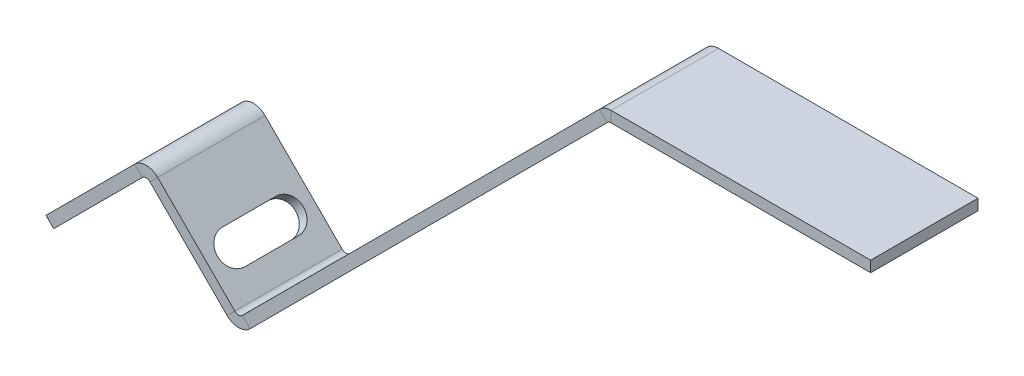
ISO-10303-21;
HEADER;
FILE_DESCRIPTION(('STEP AP214'),'2;1');
FILE_NAME('part.step','',(''),(''),'','','');
FILE_SCHEMA(('AUTOMOTIVE_DESIGN { 1 0 10303 214 1 1 1 1 }'));
ENDSEC;
DATA;
#1=APPLICATION_CONTEXT('core data for automotive mechanical design processes');
#2=APPLICATION_PROTOCOL_DEFINITION('international standard','automotive_design',2000,#1);
#3=PRODUCT_CONTEXT('',#1,'mechanical');
#4=PRODUCT('Part','Part','',(#3));
#5=PRODUCT_RELATED_PRODUCT_CATEGORY('part','',(#4));
#6=PRODUCT_DEFINITION_FORMATION('','',#4);
#7=PRODUCT_DEFINITION_CONTEXT('part definition',#1,'design');
#8=PRODUCT_DEFINITION('design','',#6,#7);
#9=PRODUCT_DEFINITION_SHAPE('','',#8);
#10=(LENGTH_UNIT() NAMED_UNIT(*) SI_UNIT(.MILLI.,.METRE.));
#11=(NAMED_UNIT(*) PLANE_ANGLE_UNIT() SI_UNIT($,.RADIAN.));
#12=(NAMED_UNIT(*) SI_UNIT($,.STERADIAN.) SOLID_ANGLE_UNIT());
#13=UNCERTAINTY_MEASURE_WITH_UNIT(LENGTH_MEASURE(1.E-05),#10,'distance_accuracy_value','');
#14=(GEOMETRIC_REPRESENTATION_CONTEXT(3) GLOBAL_UNCERTAINTY_ASSIGNED_CONTEXT((#13)) GLOBAL_UNIT_ASSIGNED_CONTEXT((#10,
#11,#12)) REPRESENTATION_CONTEXT('',''));
#15=CARTESIAN_POINT('',(0.,0.,0.));
#16=DIRECTION('',(0.,0.,1.));
#17=DIRECTION('',(1.,0.,0.));
#18=AXIS2_PLACEMENT_3D('',#15,#16,#17);
#19=CARTESIAN_POINT('',(-0.707106781186552,10.5182133701499,10.));
#20=DIRECTION('',(0.,0.,1.));
#21=DIRECTION('',(1.,0.,0.));
#22=AXIS2_PLACEMENT_3D('',#19,#20,#21);
#23=PLANE('',#22);
#24=DIRECTION('',(-0.70710678118655,0.707106781186545,0.));
#25=VECTOR('',#24,1.);
#26=CARTESIAN_POINT('',(-0.707106781186552,10.5182133701499,10.));
#27=LINE('',#26,#25);
#28=CARTESIAN_POINT('',(-0.707106781186552,10.5182133701499,10.));
#29=VERTEX_POINT('',#28);
#30=CARTESIAN_POINT('',(-2.14394776055762,11.955054349521,10.));
#31=VERTEX_POINT('',#30);
#32=EDGE_CURVE('E11',#29,#31,#27,.T.);
#33=ORIENTED_EDGE('',*,*,#32,.F.);
#34=CARTESIAN_POINT('',(0.,9.81110658896337,10.));
#35=DIRECTION('',(0.,0.,1.));
#36=DIRECTION('',(1.,0.,0.));
#37=AXIS2_PLACEMENT_3D('',#34,#35,#36);
#38=CIRCLE('',#37,1.);
#39=CARTESIAN_POINT('',(0.707106781186548,10.5182133701499,10.));
#40=VERTEX_POINT('',#39);
#41=EDGE_CURVE('E296',#29,#40,#38,.F.);
#42=ORIENTED_EDGE('',*,*,#41,.T.);
#43=DIRECTION('',(-0.707106781186549,-0.707106781186546,0.));
#44=VECTOR('',#43,1.);
#45=CARTESIAN_POINT('',(2.14394776055761,11.955054349521,10.));
#46=LINE('',#45,#44);
#47=CARTESIAN_POINT('',(2.14394776055761,11.955054349521,10.));
#48=VERTEX_POINT('',#47);
#49=EDGE_CURVE('E42',#48,#40,#46,.T.);
#50=ORIENTED_EDGE('',*,*,#49,.F.);
#51=CARTESIAN_POINT('',(0.,9.81110658896337,10.));
#52=DIRECTION('',(0.,0.,1.));
#53=DIRECTION('',(1.,0.,0.));
#54=AXIS2_PLACEMENT_3D('',#51,#52,#53);
#55=CIRCLE('',#54,3.032);
#56=EDGE_CURVE('E284',#31,#48,#55,.F.);
#57=ORIENTED_EDGE('',*,*,#56,.F.);
#58=EDGE_LOOP('',(#33,#42,#50,#57));
#59=FACE_BOUND('',#58,.T.);
#60=ADVANCED_FACE('F35',(#59),#23,.T.);
#61=CARTESIAN_POINT('',(2.14394776055761,11.955054349521,10.));
#62=DIRECTION('',(0.,0.,1.));
#63=DIRECTION('',(1.,0.,0.));
#64=AXIS2_PLACEMENT_3D('',#61,#62,#63);
#65=PLANE('',#64);
#66=DIRECTION('',(0.707106781186546,0.707106781186549,0.));
#67=VECTOR('',#66,1.);
#68=CARTESIAN_POINT('',(-17.2253201513364,-6.,10.));
#69=LINE('',#68,#67);
#70=CARTESIAN_POINT('',(-17.2253201513364,-6.,10.));
#71=VERTEX_POINT('',#70);
#72=EDGE_CURVE('E293',#71,#29,#69,.T.);
#73=ORIENTED_EDGE('',*,*,#72,.T.);
#74=ORIENTED_EDGE('',*,*,#32,.T.);
#75=DIRECTION('',(0.707106781186546,0.707106781186549,0.));
#76=VECTOR('',#75,1.);
#77=CARTESIAN_POINT('',(-18.6621611307075,-4.56315902062894,10.));
#78=LINE('',#77,#76);
#79=CARTESIAN_POINT('',(-18.6621611307075,-4.56315902062894,10.));
#80=VERTEX_POINT('',#79);
#81=EDGE_CURVE('E287',#80,#31,#78,.T.);
#82=ORIENTED_EDGE('',*,*,#81,.F.);
#83=DIRECTION('',(-0.707106781186549,0.707106781186546,0.));
#84=VECTOR('',#83,1.);
#85=CARTESIAN_POINT('',(-17.2253201513364,-6.,10.));
#86=LINE('',#85,#84);
#87=EDGE_CURVE('E290',#71,#80,#86,.T.);
#88=ORIENTED_EDGE('',*,*,#87,.F.);
#89=EDGE_LOOP('',(#73,#74,#82,#88));
#90=FACE_BOUND('',#89,.T.);
#91=ADVANCED_FACE('F461',(#90),#65,.T.);
#92=CARTESIAN_POINT('',(0.707106781186548,10.5182133701499,-10.));
#93=DIRECTION('',(0.,0.,-1.));
#94=DIRECTION('',(-1.,0.,0.));
#95=AXIS2_PLACEMENT_3D('',#92,#93,#94);
#96=PLANE('',#95);
#97=DIRECTION('',(0.707106781186549,0.707106781186546,0.));
#98=VECTOR('',#97,1.);
#99=CARTESIAN_POINT('',(0.707106781186548,10.5182133701499,-10.));
#100=LINE('',#99,#98);
#101=CARTESIAN_POINT('',(0.707106781186548,10.5182133701499,-10.));
#102=VERTEX_POINT('',#101);
#103=CARTESIAN_POINT('',(2.14394776055761,11.955054349521,-10.));
#104=VERTEX_POINT('',#103);
#105=EDGE_CURVE('E419',#102,#104,#100,.T.);
#106=ORIENTED_EDGE('',*,*,#105,.F.);
#107=CARTESIAN_POINT('',(0.,9.81110658896337,-10.));
#108=DIRECTION('',(0.,0.,1.));
#109=DIRECTION('',(1.,0.,0.));
#110=AXIS2_PLACEMENT_3D('',#107,#108,#109);
#111=CIRCLE('',#110,1.);
#112=CARTESIAN_POINT('',(-0.707106781186552,10.5182133701499,-10.));
#113=VERTEX_POINT('',#112);
#114=EDGE_CURVE('E344',#113,#102,#111,.F.);
#115=ORIENTED_EDGE('',*,*,#114,.F.);
#116=DIRECTION('',(0.70710678118655,-0.707106781186545,0.));
#117=VECTOR('',#116,1.);
#118=CARTESIAN_POINT('',(-2.14394776055762,11.955054349521,-10.));
#119=LINE('',#118,#117);
#120=CARTESIAN_POINT('',(-2.14394776055762,11.955054349521,-10.));
#121=VERTEX_POINT('',#120);
#122=EDGE_CURVE('E417',#121,#113,#119,.T.);
#123=ORIENTED_EDGE('',*,*,#122,.F.);
#124=CARTESIAN_POINT('',(0.,9.81110658896337,-10.));
#125=DIRECTION('',(0.,0.,1.));
#126=DIRECTION('',(1.,0.,0.));
#127=AXIS2_PLACEMENT_3D('',#124,#125,#126);
#128=CIRCLE('',#127,3.032);
#129=EDGE_CURVE('E332',#121,#104,#128,.F.);
#130=ORIENTED_EDGE('',*,*,#129,.T.);
#131=EDGE_LOOP('',(#106,#115,#123,#130));
#132=FACE_BOUND('',#131,.T.);
#133=ADVANCED_FACE('F471',(#132),#96,.T.);
#134=CARTESIAN_POINT('',(-2.14394776055762,11.955054349521,-10.));
#135=DIRECTION('',(0.,0.,-1.));
#136=DIRECTION('',(-1.,0.,0.));
#137=AXIS2_PLACEMENT_3D('',#134,#135,#136);
#138=PLANE('',#137);
#139=DIRECTION('',(0.707106781186546,-0.707106781186549,0.));
#140=VECTOR('',#139,1.);
#141=CARTESIAN_POINT('',(0.,11.2253201513365,-10.));
#142=LINE('',#141,#140);
#143=CARTESIAN_POINT('',(15.0813723907788,-3.85605223944237,-10.));
#144=VERTEX_POINT('',#143);
#145=EDGE_CURVE('E347',#102,#144,#142,.T.);
#146=ORIENTED_EDGE('',*,*,#145,.F.);
#147=ORIENTED_EDGE('',*,*,#105,.T.);
#148=DIRECTION('',(0.707106781186546,-0.707106781186549,0.));
#149=VECTOR('',#148,1.);
#150=CARTESIAN_POINT('',(1.43684097937107,12.6621611307075,-10.));
#151=LINE('',#150,#149);
#152=CARTESIAN_POINT('',(16.5182133701498,-2.41921126007131,-10.));
#153=VERTEX_POINT('',#152);
#154=EDGE_CURVE('E329',#104,#153,#151,.T.);
#155=ORIENTED_EDGE('',*,*,#154,.T.);
#156=DIRECTION('',(-0.70710678118655,-0.707106781186545,0.));
#157=VECTOR('',#156,1.);
#158=CARTESIAN_POINT('',(16.5182133701498,-2.41921126007131,-10.));
#159=LINE('',#158,#157);
#160=EDGE_CURVE('E409',#153,#144,#159,.T.);
#161=ORIENTED_EDGE('',*,*,#160,.T.);
#162=EDGE_LOOP('',(#146,#147,#155,#161));
#163=FACE_BOUND('',#162,.T.);
#164=ADVANCED_FACE('F473',(#163),#138,.T.);
#165=CARTESIAN_POINT('',(15.0813723907788,-3.85605223944237,10.));
#166=DIRECTION('',(0.,0.,1.));
#167=DIRECTION('',(1.,0.,0.));
#168=AXIS2_PLACEMENT_3D('',#165,#166,#167);
#169=PLANE('',#168);
#170=DIRECTION('',(0.70710678118655,0.707106781186545,0.));
#171=VECTOR('',#170,1.);
#172=CARTESIAN_POINT('',(15.0813723907788,-3.85605223944237,10.));
#173=LINE('',#172,#171);
#174=CARTESIAN_POINT('',(15.0813723907788,-3.85605223944237,10.));
#175=VERTEX_POINT('',#174);
#176=CARTESIAN_POINT('',(16.5182133701498,-2.41921126007131,10.));
#177=VERTEX_POINT('',#176);
#178=EDGE_CURVE('E415',#175,#177,#173,.T.);
#179=ORIENTED_EDGE('',*,*,#178,.F.);
#180=CARTESIAN_POINT('',(17.2253201513364,-1.71210447888477,10.));
#181=DIRECTION('',(0.,0.,-1.));
#182=DIRECTION('',(-1.,0.,0.));
#183=AXIS2_PLACEMENT_3D('',#180,#181,#182);
#184=CIRCLE('',#183,3.032);
#185=CARTESIAN_POINT('',(19.369267911894,-3.85605223944238,10.));
#186=VERTEX_POINT('',#185);
#187=EDGE_CURVE('E302',#175,#186,#184,.F.);
#188=ORIENTED_EDGE('',*,*,#187,.T.);
#189=DIRECTION('',(0.707106781186549,-0.707106781186546,0.));
#190=VECTOR('',#189,1.);
#191=CARTESIAN_POINT('',(17.9324269325229,-2.41921126007131,10.));
#192=LINE('',#191,#190);
#193=CARTESIAN_POINT('',(17.9324269325229,-2.41921126007131,10.));
#194=VERTEX_POINT('',#193);
#195=EDGE_CURVE('E413',#194,#186,#192,.T.);
#196=ORIENTED_EDGE('',*,*,#195,.F.);
#197=CARTESIAN_POINT('',(17.2253201513364,-1.71210447888477,10.));
#198=DIRECTION('',(0.,0.,1.));
#199=DIRECTION('',(1.,0.,0.));
#200=AXIS2_PLACEMENT_3D('',#197,#198,#199);
#201=CIRCLE('',#200,1.);
#202=EDGE_CURVE('E278',#177,#194,#201,.T.);
#203=ORIENTED_EDGE('',*,*,#202,.F.);
#204=EDGE_LOOP('',(#179,#188,#196,#203));
#205=FACE_BOUND('',#204,.T.);
#206=ADVANCED_FACE('F441',(#205),#169,.T.);
#207=CARTESIAN_POINT('',(17.9324269325229,-2.41921126007131,10.));
#208=DIRECTION('',(0.,0.,1.));
#209=DIRECTION('',(1.,0.,0.));
#210=AXIS2_PLACEMENT_3D('',#207,#208,#209);
#211=PLANE('',#210);
#212=DIRECTION('',(0.707106781186546,-0.707106781186549,0.));
#213=VECTOR('',#212,1.);
#214=CARTESIAN_POINT('',(0.,11.2253201513365,10.));
#215=LINE('',#214,#213);
#216=EDGE_CURVE('E299',#40,#175,#215,.T.);
#217=ORIENTED_EDGE('',*,*,#216,.T.);
#218=ORIENTED_EDGE('',*,*,#178,.T.);
#219=DIRECTION('',(0.707106781186546,-0.707106781186549,0.));
#220=VECTOR('',#219,1.);
#221=CARTESIAN_POINT('',(1.43684097937107,12.6621611307075,10.));
#222=LINE('',#221,#220);
#223=EDGE_CURVE('E281',#48,#177,#222,.T.);
#224=ORIENTED_EDGE('',*,*,#223,.F.);
#225=ORIENTED_EDGE('',*,*,#49,.T.);
#226=EDGE_LOOP('',(#217,#218,#224,#225));
#227=FACE_BOUND('',#226,.T.);
#228=ADVANCED_FACE('F422',(#227),#211,.T.);
#229=CARTESIAN_POINT('',(19.369267911894,-3.85605223944238,-10.));
#230=DIRECTION('',(0.,0.,-1.));
#231=DIRECTION('',(-1.,0.,0.));
#232=AXIS2_PLACEMENT_3D('',#229,#230,#231);
#233=PLANE('',#232);
#234=DIRECTION('',(-0.707106781186549,0.707106781186546,0.));
#235=VECTOR('',#234,1.);
#236=CARTESIAN_POINT('',(19.369267911894,-3.85605223944238,-10.));
#237=LINE('',#236,#235);
#238=CARTESIAN_POINT('',(19.369267911894,-3.85605223944238,-10.));
#239=VERTEX_POINT('',#238);
#240=CARTESIAN_POINT('',(17.9324269325229,-2.41921126007131,-10.));
#241=VERTEX_POINT('',#240);
#242=EDGE_CURVE('E411',#239,#241,#237,.T.);
#243=ORIENTED_EDGE('',*,*,#242,.F.);
#244=CARTESIAN_POINT('',(17.2253201513364,-1.71210447888477,-10.));
#245=DIRECTION('',(0.,0.,-1.));
#246=DIRECTION('',(-1.,0.,0.));
#247=AXIS2_PLACEMENT_3D('',#244,#245,#246);
#248=CIRCLE('',#247,3.032);
#249=EDGE_CURVE('E350',#144,#239,#248,.F.);
#250=ORIENTED_EDGE('',*,*,#249,.F.);
#251=ORIENTED_EDGE('',*,*,#160,.F.);
#252=CARTESIAN_POINT('',(17.2253201513364,-1.71210447888477,-10.));
#253=DIRECTION('',(0.,0.,1.));
#254=DIRECTION('',(1.,0.,0.));
#255=AXIS2_PLACEMENT_3D('',#252,#253,#254);
#256=CIRCLE('',#255,1.);
#257=EDGE_CURVE('E326',#153,#241,#256,.T.);
#258=ORIENTED_EDGE('',*,*,#257,.T.);
#259=EDGE_LOOP('',(#243,#250,#251,#258));
#260=FACE_BOUND('',#259,.T.);
#261=ADVANCED_FACE('F475',(#260),#233,.T.);
#262=CARTESIAN_POINT('',(16.5182133701498,-2.41921126007131,-10.));
#263=DIRECTION('',(0.,0.,-1.));
#264=DIRECTION('',(-1.,0.,0.));
#265=AXIS2_PLACEMENT_3D('',#262,#263,#264);
#266=PLANE('',#265);
#267=DIRECTION('',(0.707106781186546,0.707106781186549,0.));
#268=VECTOR('',#267,1.);
#269=CARTESIAN_POINT('',(17.2253201513364,-6.,-10.));
#270=LINE('',#269,#268);
#271=CARTESIAN_POINT('',(85.9324269325227,62.7071067811865,-10.));
#272=VERTEX_POINT('',#271);
#273=EDGE_CURVE('E353',#239,#272,#270,.T.);
#274=ORIENTED_EDGE('',*,*,#273,.F.);
#275=ORIENTED_EDGE('',*,*,#242,.T.);
#276=DIRECTION('',(0.707106781186546,0.707106781186549,0.));
#277=VECTOR('',#276,1.);
#278=CARTESIAN_POINT('',(15.7884791719653,-4.56315902062894,-10.));
#279=LINE('',#278,#277);
#280=CARTESIAN_POINT('',(84.4955859531516,64.1439477605576,-10.));
#281=VERTEX_POINT('',#280);
#282=EDGE_CURVE('E323',#241,#281,#279,.T.);
#283=ORIENTED_EDGE('',*,*,#282,.T.);
#284=DIRECTION('',(0.707106781186548,-0.707106781186548,0.));
#285=VECTOR('',#284,1.);
#286=CARTESIAN_POINT('',(84.4955859531516,64.1439477605576,-10.));
#287=LINE('',#286,#285);
#288=EDGE_CURVE('E401',#281,#272,#287,.T.);
#289=ORIENTED_EDGE('',*,*,#288,.T.);
#290=EDGE_LOOP('',(#274,#275,#283,#289));
#291=FACE_BOUND('',#290,.T.);
#292=ADVANCED_FACE('F481',(#291),#266,.T.);
#293=CARTESIAN_POINT('',(85.9324269325227,62.7071067811865,10.));
#294=DIRECTION('',(0.,0.,1.));
#295=DIRECTION('',(1.,0.,0.));
#296=AXIS2_PLACEMENT_3D('',#293,#294,#295);
#297=PLANE('',#296);
#298=DIRECTION('',(-0.707106781186548,0.707106781186548,0.));
#299=VECTOR('',#298,1.);
#300=CARTESIAN_POINT('',(85.9324269325227,62.7071067811865,10.));
#301=LINE('',#300,#299);
#302=CARTESIAN_POINT('',(85.9324269325227,62.7071067811865,10.));
#303=VERTEX_POINT('',#302);
#304=CARTESIAN_POINT('',(84.4955859531516,64.1439477605576,10.));
#305=VERTEX_POINT('',#304);
#306=EDGE_CURVE('E407',#303,#305,#301,.T.);
#307=ORIENTED_EDGE('',*,*,#306,.F.);
#308=CARTESIAN_POINT('',(86.6395337137093,62.,10.));
#309=DIRECTION('',(0.,0.,1.));
#310=DIRECTION('',(1.,0.,0.));
#311=AXIS2_PLACEMENT_3D('',#308,#309,#310);
#312=CIRCLE('',#311,1.);
#313=CARTESIAN_POINT('',(86.6395337137093,63.,10.));
#314=VERTEX_POINT('',#313);
#315=EDGE_CURVE('E308',#303,#314,#312,.F.);
#316=ORIENTED_EDGE('',*,*,#315,.T.);
#317=DIRECTION('',(0.,-1.,0.));
#318=VECTOR('',#317,1.);
#319=CARTESIAN_POINT('',(86.6395337137093,65.032,10.));
#320=LINE('',#319,#318);
#321=CARTESIAN_POINT('',(86.6395337137093,65.032,10.));
#322=VERTEX_POINT('',#321);
#323=EDGE_CURVE('E405',#322,#314,#320,.T.);
#324=ORIENTED_EDGE('',*,*,#323,.F.);
#325=CARTESIAN_POINT('',(86.6395337137093,62.,10.));
#326=DIRECTION('',(0.,0.,1.));
#327=DIRECTION('',(1.,0.,0.));
#328=AXIS2_PLACEMENT_3D('',#325,#326,#327);
#329=CIRCLE('',#328,3.032);
#330=EDGE_CURVE('E272',#305,#322,#329,.F.);
#331=ORIENTED_EDGE('',*,*,#330,.F.);
#332=EDGE_LOOP('',(#307,#316,#324,#331));
#333=FACE_BOUND('',#332,.T.);
#334=ADVANCED_FACE('F515',(#333),#297,.T.);
#335=CARTESIAN_POINT('',(86.6395337137093,65.032,10.));
#336=DIRECTION('',(0.,0.,1.));
#337=DIRECTION('',(1.,0.,0.));
#338=AXIS2_PLACEMENT_3D('',#335,#336,#337);
#339=PLANE('',#338);
#340=DIRECTION('',(0.707106781186546,0.707106781186549,0.));
#341=VECTOR('',#340,1.);
#342=CARTESIAN_POINT('',(17.2253201513364,-6.,10.));
#343=LINE('',#342,#341);
#344=EDGE_CURVE('E305',#186,#303,#343,.T.);
#345=ORIENTED_EDGE('',*,*,#344,.T.);
#346=ORIENTED_EDGE('',*,*,#306,.T.);
#347=DIRECTION('',(0.707106781186546,0.707106781186549,0.));
#348=VECTOR('',#347,1.);
#349=CARTESIAN_POINT('',(15.7884791719653,-4.56315902062894,10.));
#350=LINE('',#349,#348);
#351=EDGE_CURVE('E275',#194,#305,#350,.T.);
#352=ORIENTED_EDGE('',*,*,#351,.F.);
#353=ORIENTED_EDGE('',*,*,#195,.T.);
#354=EDGE_LOOP('',(#345,#346,#352,#353));
#355=FACE_BOUND('',#354,.T.);
#356=ADVANCED_FACE('F517',(#355),#339,.T.);
#357=CARTESIAN_POINT('',(86.6395337137093,63.,-10.));
#358=DIRECTION('',(0.,0.,-1.));
#359=DIRECTION('',(-1.,0.,0.));
#360=AXIS2_PLACEMENT_3D('',#357,#358,#359);
#361=PLANE('',#360);
#362=DIRECTION('',(0.,1.,0.));
#363=VECTOR('',#362,1.);
#364=CARTESIAN_POINT('',(86.6395337137093,63.,-10.));
#365=LINE('',#364,#363);
#366=CARTESIAN_POINT('',(86.6395337137093,63.,-10.));
#367=VERTEX_POINT('',#366);
#368=CARTESIAN_POINT('',(86.6395337137093,65.032,-10.));
#369=VERTEX_POINT('',#368);
#370=EDGE_CURVE('E403',#367,#369,#365,.T.);
#371=ORIENTED_EDGE('',*,*,#370,.F.);
#372=CARTESIAN_POINT('',(86.6395337137093,62.,-10.));
#373=DIRECTION('',(0.,0.,1.));
#374=DIRECTION('',(1.,0.,0.));
#375=AXIS2_PLACEMENT_3D('',#372,#373,#374);
#376=CIRCLE('',#375,1.);
#377=EDGE_CURVE('E266',#272,#367,#376,.F.);
#378=ORIENTED_EDGE('',*,*,#377,.F.);
#379=ORIENTED_EDGE('',*,*,#288,.F.);
#380=CARTESIAN_POINT('',(86.6395337137093,62.,-10.));
#381=DIRECTION('',(0.,0.,1.));
#382=DIRECTION('',(1.,0.,0.));
#383=AXIS2_PLACEMENT_3D('',#380,#381,#382);
#384=CIRCLE('',#383,3.032);
#385=EDGE_CURVE('E320',#281,#369,#384,.F.);
#386=ORIENTED_EDGE('',*,*,#385,.T.);
#387=EDGE_LOOP('',(#371,#378,#379,#386));
#388=FACE_BOUND('',#387,.T.);
#389=ADVANCED_FACE('F485',(#388),#361,.T.);
#390=CARTESIAN_POINT('',(84.4955859531516,64.1439477605576,-10.));
#391=DIRECTION('',(0.,0.,-1.));
#392=DIRECTION('',(-1.,0.,0.));
#393=AXIS2_PLACEMENT_3D('',#390,#391,#392);
#394=PLANE('',#393);
#395=DIRECTION('',(1.,0.,0.));
#396=VECTOR('',#395,1.);
#397=CARTESIAN_POINT('',(86.2253201513362,63.,-10.));
#398=LINE('',#397,#396);
#399=CARTESIAN_POINT('',(135.,63.,-10.));
#400=VERTEX_POINT('',#399);
#401=EDGE_CURVE('E256',#367,#400,#398,.T.);
#402=ORIENTED_EDGE('',*,*,#401,.F.);
#403=ORIENTED_EDGE('',*,*,#370,.T.);
#404=DIRECTION('',(1.,0.,0.));
#405=VECTOR('',#404,1.);
#406=CARTESIAN_POINT('',(86.2253201513362,65.032,-10.));
#407=LINE('',#406,#405);
#408=CARTESIAN_POINT('',(135.,65.032,-10.));
#409=VERTEX_POINT('',#408);
#410=EDGE_CURVE('E317',#369,#409,#407,.T.);
#411=ORIENTED_EDGE('',*,*,#410,.T.);
#412=DIRECTION('',(0.,-1.,0.));
#413=VECTOR('',#412,1.);
#414=CARTESIAN_POINT('',(135.,65.032,-10.));
#415=LINE('',#414,#413);
#416=EDGE_CURVE('E314',#409,#400,#415,.T.);
#417=ORIENTED_EDGE('',*,*,#416,.T.);
#418=EDGE_LOOP('',(#402,#403,#411,#417));
#419=FACE_BOUND('',#418,.T.);
#420=ADVANCED_FACE('F502',(#419),#394,.T.);
#421=CARTESIAN_POINT('',(86.2253201513362,63.,10.));
#422=DIRECTION('',(0.,1.,0.));
#423=DIRECTION('',(0.,0.,1.));
#424=AXIS2_PLACEMENT_3D('',#421,#422,#423);
#425=PLANE('',#424);
#426=ORIENTED_EDGE('',*,*,#401,.T.);
#427=DIRECTION('',(0.,0.,-1.));
#428=VECTOR('',#427,1.);
#429=CARTESIAN_POINT('',(135.,63.,10.));
#430=LINE('',#429,#428);
#431=CARTESIAN_POINT('',(135.,63.,10.));
#432=VERTEX_POINT('',#431);
#433=EDGE_CURVE('E399',#432,#400,#430,.T.);
#434=ORIENTED_EDGE('',*,*,#433,.F.);
#435=DIRECTION('',(1.,0.,0.));
#436=VECTOR('',#435,1.);
#437=CARTESIAN_POINT('',(86.2253201513362,63.,10.));
#438=LINE('',#437,#436);
#439=EDGE_CURVE('E263',#314,#432,#438,.T.);
#440=ORIENTED_EDGE('',*,*,#439,.F.);
#441=DIRECTION('',(0.,0.,-1.));
#442=VECTOR('',#441,1.);
#443=CARTESIAN_POINT('',(86.6395337137093,63.,10.));
#444=LINE('',#443,#442);
#445=EDGE_CURVE('E311',#314,#367,#444,.T.);
#446=ORIENTED_EDGE('',*,*,#445,.T.);
#447=EDGE_LOOP('',(#426,#434,#440,#446));
#448=FACE_BOUND('',#447,.T.);
#449=ADVANCED_FACE('F509',(#448),#425,.F.);
#450=CARTESIAN_POINT('',(135.,65.032,10.));
#451=DIRECTION('',(1.,0.,0.));
#452=DIRECTION('',(0.,0.,-1.));
#453=AXIS2_PLACEMENT_3D('',#450,#451,#452);
#454=PLANE('',#453);
#455=ORIENTED_EDGE('',*,*,#416,.F.);
#456=DIRECTION('',(0.,0.,-1.));
#457=VECTOR('',#456,1.);
#458=CARTESIAN_POINT('',(135.,65.032,10.));
#459=LINE('',#458,#457);
#460=CARTESIAN_POINT('',(135.,65.032,10.));
#461=VERTEX_POINT('',#460);
#462=EDGE_CURVE('E397',#461,#409,#459,.T.);
#463=ORIENTED_EDGE('',*,*,#462,.F.);
#464=DIRECTION('',(0.,-1.,0.));
#465=VECTOR('',#464,1.);
#466=CARTESIAN_POINT('',(135.,65.032,10.));
#467=LINE('',#466,#465);
#468=EDGE_CURVE('E265',#461,#432,#467,.T.);
#469=ORIENTED_EDGE('',*,*,#468,.T.);
#470=ORIENTED_EDGE('',*,*,#433,.T.);
#471=EDGE_LOOP('',(#455,#463,#469,#470));
#472=FACE_BOUND('',#471,.T.);
#473=ADVANCED_FACE('F583',(#472),#454,.T.);
#474=CARTESIAN_POINT('',(86.2253201513362,65.032,10.));
#475=DIRECTION('',(0.,1.,0.));
#476=DIRECTION('',(0.,0.,1.));
#477=AXIS2_PLACEMENT_3D('',#474,#475,#476);
#478=PLANE('',#477);
#479=ORIENTED_EDGE('',*,*,#410,.F.);
#480=DIRECTION('',(0.,0.,-1.));
#481=VECTOR('',#480,1.);
#482=CARTESIAN_POINT('',(86.6395337137093,65.032,10.));
#483=LINE('',#482,#481);
#484=EDGE_CURVE('E394',#322,#369,#483,.T.);
#485=ORIENTED_EDGE('',*,*,#484,.F.);
#486=DIRECTION('',(1.,0.,0.));
#487=VECTOR('',#486,1.);
#488=CARTESIAN_POINT('',(86.2253201513362,65.032,10.));
#489=LINE('',#488,#487);
#490=EDGE_CURVE('E269',#322,#461,#489,.T.);
#491=ORIENTED_EDGE('',*,*,#490,.T.);
#492=ORIENTED_EDGE('',*,*,#462,.T.);
#493=EDGE_LOOP('',(#479,#485,#491,#492));
#494=FACE_BOUND('',#493,.T.);
#495=ADVANCED_FACE('F498',(#494),#478,.T.);
#496=CARTESIAN_POINT('',(86.6395337137093,62.,10.));
#497=DIRECTION('',(0.,0.,-1.));
#498=DIRECTION('',(-1.,0.,0.));
#499=AXIS2_PLACEMENT_3D('',#496,#497,#498);
#500=CYLINDRICAL_SURFACE('',#499,3.032);
#501=ORIENTED_EDGE('',*,*,#385,.F.);
#502=DIRECTION('',(0.,0.,-1.));
#503=VECTOR('',#502,1.);
#504=CARTESIAN_POINT('',(84.4955859531516,64.1439477605576,10.));
#505=LINE('',#504,#503);
#506=EDGE_CURVE('E391',#305,#281,#505,.T.);
#507=ORIENTED_EDGE('',*,*,#506,.F.);
#508=ORIENTED_EDGE('',*,*,#330,.T.);
#509=ORIENTED_EDGE('',*,*,#484,.T.);
#510=EDGE_LOOP('',(#501,#507,#508,#509));
#511=FACE_BOUND('',#510,.T.);
#512=ADVANCED_FACE('F493',(#511),#500,.T.);
#513=CARTESIAN_POINT('',(15.7884791719653,-4.56315902062894,10.));
#514=DIRECTION('',(-0.707106781186549,0.707106781186546,0.));
#515=DIRECTION('',(-0.707106781186546,-0.707106781186549,0.));
#516=AXIS2_PLACEMENT_3D('',#513,#514,#515);
#517=PLANE('',#516);
#518=ORIENTED_EDGE('',*,*,#282,.F.);
#519=DIRECTION('',(0.,0.,-1.));
#520=VECTOR('',#519,1.);
#521=CARTESIAN_POINT('',(17.9324269325229,-2.41921126007131,10.));
#522=LINE('',#521,#520);
#523=EDGE_CURVE('E388',#194,#241,#522,.T.);
#524=ORIENTED_EDGE('',*,*,#523,.F.);
#525=ORIENTED_EDGE('',*,*,#351,.T.);
#526=ORIENTED_EDGE('',*,*,#506,.T.);
#527=EDGE_LOOP('',(#518,#524,#525,#526));
#528=FACE_BOUND('',#527,.T.);
#529=ADVANCED_FACE('F489',(#528),#517,.T.);
#530=CARTESIAN_POINT('',(17.2253201513364,-1.71210447888477,10.));
#531=DIRECTION('',(0.,0.,-1.));
#532=DIRECTION('',(-1.,0.,0.));
#533=AXIS2_PLACEMENT_3D('',#530,#531,#532);
#534=CYLINDRICAL_SURFACE('',#533,1.);
#535=ORIENTED_EDGE('',*,*,#257,.F.);
#536=DIRECTION('',(0.,0.,-1.));
#537=VECTOR('',#536,1.);
#538=CARTESIAN_POINT('',(16.5182133701498,-2.41921126007131,10.));
#539=LINE('',#538,#537);
#540=EDGE_CURVE('E385',#177,#153,#539,.T.);
#541=ORIENTED_EDGE('',*,*,#540,.F.);
#542=ORIENTED_EDGE('',*,*,#202,.T.);
#543=ORIENTED_EDGE('',*,*,#523,.T.);
#544=EDGE_LOOP('',(#535,#541,#542,#543));
#545=FACE_BOUND('',#544,.T.);
#546=ADVANCED_FACE('F447',(#545),#534,.F.);
#547=CARTESIAN_POINT('',(1.43684097937107,12.6621611307075,10.));
#548=DIRECTION('',(0.707106781186549,0.707106781186546,0.));
#549=DIRECTION('',(-0.707106781186546,0.707106781186549,0.));
#550=AXIS2_PLACEMENT_3D('',#547,#548,#549);
#551=PLANE('',#550);
#552=CARTESIAN_POINT('',(11.2921417421586,2.80686036791998,5.));
#553=DIRECTION('',(0.707106781186549,0.707106781186546,0.));
#554=DIRECTION('',(-0.707106781186546,0.707106781186549,0.));
#555=AXIS2_PLACEMENT_3D('',#552,#553,#554);
#556=CIRCLE('',#555,3.);
#557=CARTESIAN_POINT('',(9.17082139859894,4.92818071147963,5.));
#558=VERTEX_POINT('',#557);
#559=CARTESIAN_POINT('',(13.4134620857182,0.685540024360333,5.));
#560=VERTEX_POINT('',#559);
#561=EDGE_CURVE('E49',#558,#560,#556,.T.);
#562=ORIENTED_EDGE('',*,*,#561,.F.);
#563=DIRECTION('',(0.,0.,1.));
#564=VECTOR('',#563,1.);
#565=CARTESIAN_POINT('',(9.17082139859894,4.92818071147963,5.));
#566=LINE('',#565,#564);
#567=CARTESIAN_POINT('',(9.17082139859894,4.92818071147963,-5.));
#568=VERTEX_POINT('',#567);
#569=EDGE_CURVE('E212',#568,#558,#566,.T.);
#570=ORIENTED_EDGE('',*,*,#569,.F.);
#571=CARTESIAN_POINT('',(11.2921417421586,2.80686036791998,-5.));
#572=DIRECTION('',(0.707106781186549,0.707106781186546,0.));
#573=DIRECTION('',(-0.707106781186546,0.707106781186549,0.));
#574=AXIS2_PLACEMENT_3D('',#571,#572,#573);
#575=CIRCLE('',#574,3.);
#576=CARTESIAN_POINT('',(13.4134620857182,0.685540024360335,-5.));
#577=VERTEX_POINT('',#576);
#578=EDGE_CURVE('E215',#577,#568,#575,.T.);
#579=ORIENTED_EDGE('',*,*,#578,.F.);
#580=DIRECTION('',(0.,0.,-1.));
#581=VECTOR('',#580,1.);
#582=CARTESIAN_POINT('',(13.4134620857182,0.685540024360335,5.));
#583=LINE('',#582,#581);
#584=EDGE_CURVE('E221',#560,#577,#583,.T.);
#585=ORIENTED_EDGE('',*,*,#584,.F.);
#586=EDGE_LOOP('',(#562,#570,#579,#585));
#587=FACE_BOUND('',#586,.T.);
#588=ORIENTED_EDGE('',*,*,#154,.F.);
#589=DIRECTION('',(0.,0.,-1.));
#590=VECTOR('',#589,1.);
#591=CARTESIAN_POINT('',(2.14394776055761,11.955054349521,10.));
#592=LINE('',#591,#590);
#593=EDGE_CURVE('E382',#48,#104,#592,.T.);
#594=ORIENTED_EDGE('',*,*,#593,.F.);
#595=ORIENTED_EDGE('',*,*,#223,.T.);
#596=ORIENTED_EDGE('',*,*,#540,.T.);
#597=EDGE_LOOP('',(#588,#594,#595,#596));
#598=FACE_BOUND('',#597,.T.);
#599=ADVANCED_FACE('F450',(#587,#598),#551,.T.);
#600=CARTESIAN_POINT('',(0.,9.81110658896337,10.));
#601=DIRECTION('',(0.,0.,-1.));
#602=DIRECTION('',(-1.,0.,0.));
#603=AXIS2_PLACEMENT_3D('',#600,#601,#602);
#604=CYLINDRICAL_SURFACE('',#603,3.032);
#605=ORIENTED_EDGE('',*,*,#129,.F.);
#606=DIRECTION('',(0.,0.,-1.));
#607=VECTOR('',#606,1.);
#608=CARTESIAN_POINT('',(-2.14394776055762,11.955054349521,10.));
#609=LINE('',#608,#607);
#610=EDGE_CURVE('E379',#31,#121,#609,.T.);
#611=ORIENTED_EDGE('',*,*,#610,.F.);
#612=ORIENTED_EDGE('',*,*,#56,.T.);
#613=ORIENTED_EDGE('',*,*,#593,.T.);
#614=EDGE_LOOP('',(#605,#611,#612,#613));
#615=FACE_BOUND('',#614,.T.);
#616=ADVANCED_FACE('F453',(#615),#604,.T.);
#617=CARTESIAN_POINT('',(-18.6621611307075,-4.56315902062894,10.));
#618=DIRECTION('',(-0.707106781186549,0.707106781186546,0.));
#619=DIRECTION('',(-0.707106781186546,-0.707106781186549,0.));
#620=AXIS2_PLACEMENT_3D('',#617,#618,#619);
#621=PLANE('',#620);
#622=CARTESIAN_POINT('',(-12.7063553045317,1.39264680554689,-5.));
#623=DIRECTION('',(-0.707106781186549,0.707106781186546,0.));
#624=DIRECTION('',(-0.707106781186546,-0.707106781186549,0.));
#625=AXIS2_PLACEMENT_3D('',#622,#623,#624);
#626=CIRCLE('',#625,3.);
#627=CARTESIAN_POINT('',(-10.585034960972,3.51396714910653,-5.));
#628=VERTEX_POINT('',#627);
#629=CARTESIAN_POINT('',(-14.8276756480913,-0.728673538012763,-5.));
#630=VERTEX_POINT('',#629);
#631=EDGE_CURVE('E227',#628,#630,#626,.T.);
#632=ORIENTED_EDGE('',*,*,#631,.F.);
#633=DIRECTION('',(0.,0.,-1.));
#634=VECTOR('',#633,1.);
#635=CARTESIAN_POINT('',(-10.585034960972,3.51396714910653,-5.));
#636=LINE('',#635,#634);
#637=CARTESIAN_POINT('',(-10.585034960972,3.51396714910653,5.));
#638=VERTEX_POINT('',#637);
#639=EDGE_CURVE('E235',#638,#628,#636,.T.);
#640=ORIENTED_EDGE('',*,*,#639,.F.);
#641=CARTESIAN_POINT('',(-12.7063553045317,1.39264680554689,5.));
#642=DIRECTION('',(-0.707106781186549,0.707106781186546,0.));
#643=DIRECTION('',(-0.707106781186546,-0.707106781186549,0.));
#644=AXIS2_PLACEMENT_3D('',#641,#642,#643);
#645=CIRCLE('',#644,3.);
#646=CARTESIAN_POINT('',(-14.8276756480913,-0.72867353801276,5.));
#647=VERTEX_POINT('',#646);
#648=EDGE_CURVE('E249',#647,#638,#645,.T.);
#649=ORIENTED_EDGE('',*,*,#648,.F.);
#650=DIRECTION('',(0.,0.,1.));
#651=VECTOR('',#650,1.);
#652=CARTESIAN_POINT('',(-14.8276756480913,-0.72867353801276,-5.));
#653=LINE('',#652,#651);
#654=EDGE_CURVE('E246',#630,#647,#653,.T.);
#655=ORIENTED_EDGE('',*,*,#654,.F.);
#656=EDGE_LOOP('',(#632,#640,#649,#655));
#657=FACE_BOUND('',#656,.T.);
#658=DIRECTION('',(0.707106781186546,0.707106781186549,0.));
#659=VECTOR('',#658,1.);
#660=CARTESIAN_POINT('',(-18.6621611307075,-4.56315902062894,-10.));
#661=LINE('',#660,#659);
#662=CARTESIAN_POINT('',(-18.6621611307075,-4.56315902062894,-10.));
#663=VERTEX_POINT('',#662);
#664=EDGE_CURVE('E335',#663,#121,#661,.T.);
#665=ORIENTED_EDGE('',*,*,#664,.F.);
#666=DIRECTION('',(0.,0.,-1.));
#667=VECTOR('',#666,1.);
#668=CARTESIAN_POINT('',(-18.6621611307075,-4.56315902062894,10.));
#669=LINE('',#668,#667);
#670=EDGE_CURVE('E377',#80,#663,#669,.T.);
#671=ORIENTED_EDGE('',*,*,#670,.F.);
#672=ORIENTED_EDGE('',*,*,#81,.T.);
#673=ORIENTED_EDGE('',*,*,#610,.T.);
#674=EDGE_LOOP('',(#665,#671,#672,#673));
#675=FACE_BOUND('',#674,.T.);
#676=ADVANCED_FACE('F458',(#657,#675),#621,.T.);
#677=CARTESIAN_POINT('',(-17.2253201513364,-6.,10.));
#678=DIRECTION('',(-0.707106781186546,-0.707106781186549,0.));
#679=DIRECTION('',(0.707106781186549,-0.707106781186546,0.));
#680=AXIS2_PLACEMENT_3D('',#677,#678,#679);
#681=PLANE('',#680);
#682=DIRECTION('',(-0.707106781186549,0.707106781186546,0.));
#683=VECTOR('',#682,1.);
#684=CARTESIAN_POINT('',(-17.2253201513364,-6.,-10.));
#685=LINE('',#684,#683);
#686=CARTESIAN_POINT('',(-17.2253201513364,-6.,-10.));
#687=VERTEX_POINT('',#686);
#688=EDGE_CURVE('E338',#687,#663,#685,.T.);
#689=ORIENTED_EDGE('',*,*,#688,.F.);
#690=DIRECTION('',(0.,0.,-1.));
#691=VECTOR('',#690,1.);
#692=CARTESIAN_POINT('',(-17.2253201513364,-6.,10.));
#693=LINE('',#692,#691);
#694=EDGE_CURVE('E375',#71,#687,#693,.T.);
#695=ORIENTED_EDGE('',*,*,#694,.F.);
#696=ORIENTED_EDGE('',*,*,#87,.T.);
#697=ORIENTED_EDGE('',*,*,#670,.T.);
#698=EDGE_LOOP('',(#689,#695,#696,#697));
#699=FACE_BOUND('',#698,.T.);
#700=ADVANCED_FACE('F464',(#699),#681,.T.);
#701=CARTESIAN_POINT('',(-17.2253201513364,-6.,10.));
#702=DIRECTION('',(-0.707106781186549,0.707106781186546,0.));
#703=DIRECTION('',(-0.707106781186546,-0.707106781186549,0.));
#704=AXIS2_PLACEMENT_3D('',#701,#702,#703);
#705=PLANE('',#704);
#706=DIRECTION('',(0.,0.,-1.));
#707=VECTOR('',#706,1.);
#708=CARTESIAN_POINT('',(-9.14819398160096,2.07712616973547,-5.));
#709=LINE('',#708,#707);
#710=CARTESIAN_POINT('',(-9.14819398160096,2.07712616973547,5.));
#711=VERTEX_POINT('',#710);
#712=CARTESIAN_POINT('',(-9.14819398160096,2.07712616973547,-5.));
#713=VERTEX_POINT('',#712);
#714=EDGE_CURVE('E241',#711,#713,#709,.T.);
#715=ORIENTED_EDGE('',*,*,#714,.T.);
#716=CARTESIAN_POINT('',(-11.2695143251606,-0.044194173824176,-5.));
#717=DIRECTION('',(-0.707106781186549,0.707106781186546,0.));
#718=DIRECTION('',(-0.707106781186546,-0.707106781186549,0.));
#719=AXIS2_PLACEMENT_3D('',#716,#717,#718);
#720=CIRCLE('',#719,3.);
#721=CARTESIAN_POINT('',(-13.3908346687202,-2.16551451738382,-5.));
#722=VERTEX_POINT('',#721);
#723=EDGE_CURVE('E231',#713,#722,#720,.T.);
#724=ORIENTED_EDGE('',*,*,#723,.T.);
#725=DIRECTION('',(0.,0.,1.));
#726=VECTOR('',#725,1.);
#727=CARTESIAN_POINT('',(-13.3908346687202,-2.16551451738382,-5.));
#728=LINE('',#727,#726);
#729=CARTESIAN_POINT('',(-13.3908346687202,-2.16551451738383,5.));
#730=VERTEX_POINT('',#729);
#731=EDGE_CURVE('E234',#722,#730,#728,.T.);
#732=ORIENTED_EDGE('',*,*,#731,.T.);
#733=CARTESIAN_POINT('',(-11.2695143251606,-0.044194173824176,5.));
#734=DIRECTION('',(-0.707106781186549,0.707106781186546,0.));
#735=DIRECTION('',(-0.707106781186546,-0.707106781186549,0.));
#736=AXIS2_PLACEMENT_3D('',#733,#734,#735);
#737=CIRCLE('',#736,3.);
#738=EDGE_CURVE('E238',#730,#711,#737,.T.);
#739=ORIENTED_EDGE('',*,*,#738,.T.);
#740=EDGE_LOOP('',(#715,#724,#732,#739));
#741=FACE_BOUND('',#740,.T.);
#742=DIRECTION('',(0.707106781186546,0.707106781186549,0.));
#743=VECTOR('',#742,1.);
#744=CARTESIAN_POINT('',(-17.2253201513364,-6.,-10.));
#745=LINE('',#744,#743);
#746=EDGE_CURVE('E341',#687,#113,#745,.T.);
#747=ORIENTED_EDGE('',*,*,#746,.T.);
#748=DIRECTION('',(0.,0.,-1.));
#749=VECTOR('',#748,1.);
#750=CARTESIAN_POINT('',(-0.707106781186552,10.5182133701499,10.));
#751=LINE('',#750,#749);
#752=EDGE_CURVE('E372',#29,#113,#751,.T.);
#753=ORIENTED_EDGE('',*,*,#752,.F.);
#754=ORIENTED_EDGE('',*,*,#72,.F.);
#755=ORIENTED_EDGE('',*,*,#694,.T.);
#756=EDGE_LOOP('',(#747,#753,#754,#755));
#757=FACE_BOUND('',#756,.T.);
#758=ADVANCED_FACE('F469',(#741,#757),#705,.F.);
#759=CARTESIAN_POINT('',(0.,9.81110658896337,10.));
#760=DIRECTION('',(0.,0.,-1.));
#761=DIRECTION('',(-1.,0.,0.));
#762=AXIS2_PLACEMENT_3D('',#759,#760,#761);
#763=CYLINDRICAL_SURFACE('',#762,1.);
#764=ORIENTED_EDGE('',*,*,#114,.T.);
#765=DIRECTION('',(0.,0.,-1.));
#766=VECTOR('',#765,1.);
#767=CARTESIAN_POINT('',(0.707106781186548,10.5182133701499,10.));
#768=LINE('',#767,#766);
#769=EDGE_CURVE('E369',#40,#102,#768,.T.);
#770=ORIENTED_EDGE('',*,*,#769,.F.);
#771=ORIENTED_EDGE('',*,*,#41,.F.);
#772=ORIENTED_EDGE('',*,*,#752,.T.);
#773=EDGE_LOOP('',(#764,#770,#771,#772));
#774=FACE_BOUND('',#773,.T.);
#775=ADVANCED_FACE('F431',(#774),#763,.F.);
#776=CARTESIAN_POINT('',(0.,11.2253201513365,10.));
#777=DIRECTION('',(0.707106781186549,0.707106781186546,0.));
#778=DIRECTION('',(-0.707106781186546,0.707106781186549,0.));
#779=AXIS2_PLACEMENT_3D('',#776,#777,#778);
#780=PLANE('',#779);
#781=DIRECTION('',(0.,0.,1.));
#782=VECTOR('',#781,1.);
#783=CARTESIAN_POINT('',(7.73398041922787,3.49133973210856,5.));
#784=LINE('',#783,#782);
#785=CARTESIAN_POINT('',(7.73398041922787,3.49133973210856,-5.));
#786=VERTEX_POINT('',#785);
#787=CARTESIAN_POINT('',(7.73398041922787,3.49133973210856,5.));
#788=VERTEX_POINT('',#787);
#789=EDGE_CURVE('E202',#786,#788,#784,.T.);
#790=ORIENTED_EDGE('',*,*,#789,.T.);
#791=CARTESIAN_POINT('',(9.85530076278751,1.37001938854892,5.));
#792=DIRECTION('',(0.707106781186549,0.707106781186546,0.));
#793=DIRECTION('',(-0.707106781186546,0.707106781186549,0.));
#794=AXIS2_PLACEMENT_3D('',#791,#792,#793);
#795=CIRCLE('',#794,3.);
#796=CARTESIAN_POINT('',(11.9766211063471,-0.751300955010727,5.));
#797=VERTEX_POINT('',#796);
#798=EDGE_CURVE('E196',#788,#797,#795,.T.);
#799=ORIENTED_EDGE('',*,*,#798,.T.);
#800=DIRECTION('',(0.,0.,-1.));
#801=VECTOR('',#800,1.);
#802=CARTESIAN_POINT('',(11.9766211063471,-0.751300955010727,5.));
#803=LINE('',#802,#801);
#804=CARTESIAN_POINT('',(11.9766211063471,-0.751300955010728,-5.));
#805=VERTEX_POINT('',#804);
#806=EDGE_CURVE('E205',#797,#805,#803,.T.);
#807=ORIENTED_EDGE('',*,*,#806,.T.);
#808=CARTESIAN_POINT('',(9.85530076278751,1.37001938854892,-5.));
#809=DIRECTION('',(0.707106781186549,0.707106781186546,0.));
#810=DIRECTION('',(-0.707106781186546,0.707106781186549,0.));
#811=AXIS2_PLACEMENT_3D('',#808,#809,#810);
#812=CIRCLE('',#811,3.);
#813=EDGE_CURVE('E57',#805,#786,#812,.T.);
#814=ORIENTED_EDGE('',*,*,#813,.T.);
#815=EDGE_LOOP('',(#790,#799,#807,#814));
#816=FACE_BOUND('',#815,.T.);
#817=ORIENTED_EDGE('',*,*,#145,.T.);
#818=DIRECTION('',(0.,0.,-1.));
#819=VECTOR('',#818,1.);
#820=CARTESIAN_POINT('',(15.0813723907788,-3.85605223944237,10.));
#821=LINE('',#820,#819);
#822=EDGE_CURVE('E366',#175,#144,#821,.T.);
#823=ORIENTED_EDGE('',*,*,#822,.F.);
#824=ORIENTED_EDGE('',*,*,#216,.F.);
#825=ORIENTED_EDGE('',*,*,#769,.T.);
#826=EDGE_LOOP('',(#817,#823,#824,#825));
#827=FACE_BOUND('',#826,.T.);
#828=ADVANCED_FACE('F209',(#816,#827),#780,.F.);
#829=CARTESIAN_POINT('',(17.2253201513364,-1.71210447888477,10.));
#830=DIRECTION('',(0.,0.,-1.));
#831=DIRECTION('',(-1.,0.,0.));
#832=AXIS2_PLACEMENT_3D('',#829,#830,#831);
#833=CYLINDRICAL_SURFACE('',#832,3.032);
#834=ORIENTED_EDGE('',*,*,#249,.T.);
#835=DIRECTION('',(0.,0.,-1.));
#836=VECTOR('',#835,1.);
#837=CARTESIAN_POINT('',(19.369267911894,-3.85605223944238,10.));
#838=LINE('',#837,#836);
#839=EDGE_CURVE('E363',#186,#239,#838,.T.);
#840=ORIENTED_EDGE('',*,*,#839,.F.);
#841=ORIENTED_EDGE('',*,*,#187,.F.);
#842=ORIENTED_EDGE('',*,*,#822,.T.);
#843=EDGE_LOOP('',(#834,#840,#841,#842));
#844=FACE_BOUND('',#843,.T.);
#845=ADVANCED_FACE('F438',(#844),#833,.T.);
#846=CARTESIAN_POINT('',(17.2253201513364,-6.,10.));
#847=DIRECTION('',(-0.707106781186549,0.707106781186546,0.));
#848=DIRECTION('',(-0.707106781186546,-0.707106781186549,0.));
#849=AXIS2_PLACEMENT_3D('',#846,#847,#848);
#850=PLANE('',#849);
#851=ORIENTED_EDGE('',*,*,#273,.T.);
#852=DIRECTION('',(0.,0.,-1.));
#853=VECTOR('',#852,1.);
#854=CARTESIAN_POINT('',(85.9324269325227,62.7071067811865,10.));
#855=LINE('',#854,#853);
#856=EDGE_CURVE('E360',#303,#272,#855,.T.);
#857=ORIENTED_EDGE('',*,*,#856,.F.);
#858=ORIENTED_EDGE('',*,*,#344,.F.);
#859=ORIENTED_EDGE('',*,*,#839,.T.);
#860=EDGE_LOOP('',(#851,#857,#858,#859));
#861=FACE_BOUND('',#860,.T.);
#862=ADVANCED_FACE('F478',(#861),#850,.F.);
#863=CARTESIAN_POINT('',(86.6395337137093,62.,10.));
#864=DIRECTION('',(0.,0.,-1.));
#865=DIRECTION('',(-1.,0.,0.));
#866=AXIS2_PLACEMENT_3D('',#863,#864,#865);
#867=CYLINDRICAL_SURFACE('',#866,1.);
#868=ORIENTED_EDGE('',*,*,#377,.T.);
#869=ORIENTED_EDGE('',*,*,#445,.F.);
#870=ORIENTED_EDGE('',*,*,#315,.F.);
#871=ORIENTED_EDGE('',*,*,#856,.T.);
#872=EDGE_LOOP('',(#868,#869,#870,#871));
#873=FACE_BOUND('',#872,.T.);
#874=ADVANCED_FACE('F505',(#873),#867,.F.);
#875=CARTESIAN_POINT('',(86.6395337137093,62.,10.));
#876=DIRECTION('',(0.,0.,1.));
#877=DIRECTION('',(1.,0.,0.));
#878=AXIS2_PLACEMENT_3D('',#875,#876,#877);
#879=PLANE('',#878);
#880=ORIENTED_EDGE('',*,*,#439,.T.);
#881=ORIENTED_EDGE('',*,*,#468,.F.);
#882=ORIENTED_EDGE('',*,*,#490,.F.);
#883=ORIENTED_EDGE('',*,*,#323,.T.);
#884=EDGE_LOOP('',(#880,#881,#882,#883));
#885=FACE_BOUND('',#884,.T.);
#886=ADVANCED_FACE('F513',(#885),#879,.T.);
#887=CARTESIAN_POINT('',(86.6395337137093,62.,-10.));
#888=DIRECTION('',(0.,0.,1.));
#889=DIRECTION('',(1.,0.,0.));
#890=AXIS2_PLACEMENT_3D('',#887,#888,#889);
#891=PLANE('',#890);
#892=ORIENTED_EDGE('',*,*,#664,.T.);
#893=ORIENTED_EDGE('',*,*,#122,.T.);
#894=ORIENTED_EDGE('',*,*,#746,.F.);
#895=ORIENTED_EDGE('',*,*,#688,.T.);
#896=EDGE_LOOP('',(#892,#893,#894,#895));
#897=FACE_BOUND('',#896,.T.);
#898=ADVANCED_FACE('F701',(#897),#891,.F.);
#899=CARTESIAN_POINT('',(-11.2695143251606,-0.044194173824176,-5.));
#900=DIRECTION('',(-0.707106781186549,0.707106781186546,0.));
#901=DIRECTION('',(-0.707106781186546,-0.707106781186549,0.));
#902=AXIS2_PLACEMENT_3D('',#899,#900,#901);
#903=CYLINDRICAL_SURFACE('',#902,3.);
#904=ORIENTED_EDGE('',*,*,#631,.T.);
#905=DIRECTION('',(-0.707106781186549,0.707106781186546,0.));
#906=VECTOR('',#905,1.);
#907=CARTESIAN_POINT('',(-13.3908346687202,-2.16551451738382,-5.));
#908=LINE('',#907,#906);
#909=EDGE_CURVE('E244',#722,#630,#908,.T.);
#910=ORIENTED_EDGE('',*,*,#909,.F.);
#911=ORIENTED_EDGE('',*,*,#723,.F.);
#912=DIRECTION('',(-0.707106781186549,0.707106781186546,0.));
#913=VECTOR('',#912,1.);
#914=CARTESIAN_POINT('',(-9.14819398160096,2.07712616973547,-5.));
#915=LINE('',#914,#913);
#916=EDGE_CURVE('E254',#713,#628,#915,.T.);
#917=ORIENTED_EDGE('',*,*,#916,.T.);
#918=EDGE_LOOP('',(#904,#910,#911,#917));
#919=FACE_BOUND('',#918,.T.);
#920=ADVANCED_FACE('F711',(#919),#903,.F.);
#921=CARTESIAN_POINT('',(-9.14819398160096,2.07712616973547,-5.));
#922=DIRECTION('',(0.707106781186546,0.707106781186549,0.));
#923=DIRECTION('',(-0.707106781186549,0.707106781186546,0.));
#924=AXIS2_PLACEMENT_3D('',#921,#922,#923);
#925=PLANE('',#924);
#926=ORIENTED_EDGE('',*,*,#639,.T.);
#927=ORIENTED_EDGE('',*,*,#916,.F.);
#928=ORIENTED_EDGE('',*,*,#714,.F.);
#929=DIRECTION('',(-0.707106781186549,0.707106781186546,0.));
#930=VECTOR('',#929,1.);
#931=CARTESIAN_POINT('',(-9.14819398160096,2.07712616973547,5.));
#932=LINE('',#931,#930);
#933=EDGE_CURVE('E257',#711,#638,#932,.T.);
#934=ORIENTED_EDGE('',*,*,#933,.T.);
#935=EDGE_LOOP('',(#926,#927,#928,#934));
#936=FACE_BOUND('',#935,.T.);
#937=ADVANCED_FACE('F738',(#936),#925,.F.);
#938=CARTESIAN_POINT('',(-11.2695143251606,-0.044194173824176,5.));
#939=DIRECTION('',(-0.707106781186549,0.707106781186546,0.));
#940=DIRECTION('',(-0.707106781186546,-0.707106781186549,0.));
#941=AXIS2_PLACEMENT_3D('',#938,#939,#940);
#942=CYLINDRICAL_SURFACE('',#941,3.);
#943=ORIENTED_EDGE('',*,*,#648,.T.);
#944=ORIENTED_EDGE('',*,*,#933,.F.);
#945=ORIENTED_EDGE('',*,*,#738,.F.);
#946=DIRECTION('',(-0.707106781186549,0.707106781186546,0.));
#947=VECTOR('',#946,1.);
#948=CARTESIAN_POINT('',(-13.3908346687202,-2.16551451738382,5.));
#949=LINE('',#948,#947);
#950=EDGE_CURVE('E259',#730,#647,#949,.T.);
#951=ORIENTED_EDGE('',*,*,#950,.T.);
#952=EDGE_LOOP('',(#943,#944,#945,#951));
#953=FACE_BOUND('',#952,.T.);
#954=ADVANCED_FACE('F749',(#953),#942,.F.);
#955=CARTESIAN_POINT('',(-13.3908346687202,-2.16551451738382,-5.));
#956=DIRECTION('',(-0.707106781186546,-0.707106781186549,0.));
#957=DIRECTION('',(0.707106781186549,-0.707106781186546,0.));
#958=AXIS2_PLACEMENT_3D('',#955,#956,#957);
#959=PLANE('',#958);
#960=ORIENTED_EDGE('',*,*,#654,.T.);
#961=ORIENTED_EDGE('',*,*,#950,.F.);
#962=ORIENTED_EDGE('',*,*,#731,.F.);
#963=ORIENTED_EDGE('',*,*,#909,.T.);
#964=EDGE_LOOP('',(#960,#961,#962,#963));
#965=FACE_BOUND('',#964,.T.);
#966=ADVANCED_FACE('F760',(#965),#959,.F.);
#967=CARTESIAN_POINT('',(9.85530076278751,1.37001938854892,5.));
#968=DIRECTION('',(0.707106781186549,0.707106781186546,0.));
#969=DIRECTION('',(-0.707106781186546,0.707106781186549,0.));
#970=AXIS2_PLACEMENT_3D('',#967,#968,#969);
#971=CYLINDRICAL_SURFACE('',#970,3.);
#972=ORIENTED_EDGE('',*,*,#561,.T.);
#973=DIRECTION('',(0.707106781186549,0.707106781186546,0.));
#974=VECTOR('',#973,1.);
#975=CARTESIAN_POINT('',(11.9766211063471,-0.751300955010727,5.));
#976=LINE('',#975,#974);
#977=EDGE_CURVE('E192',#797,#560,#976,.T.);
#978=ORIENTED_EDGE('',*,*,#977,.F.);
#979=ORIENTED_EDGE('',*,*,#798,.F.);
#980=DIRECTION('',(0.707106781186549,0.707106781186546,0.));
#981=VECTOR('',#980,1.);
#982=CARTESIAN_POINT('',(7.73398041922787,3.49133973210856,5.));
#983=LINE('',#982,#981);
#984=EDGE_CURVE('E225',#788,#558,#983,.T.);
#985=ORIENTED_EDGE('',*,*,#984,.T.);
#986=EDGE_LOOP('',(#972,#978,#979,#985));
#987=FACE_BOUND('',#986,.T.);
#988=ADVANCED_FACE('F194',(#987),#971,.F.);
#989=CARTESIAN_POINT('',(7.73398041922787,3.49133973210856,5.));
#990=DIRECTION('',(-0.707106781186546,0.707106781186549,0.));
#991=DIRECTION('',(-0.707106781186549,-0.707106781186546,0.));
#992=AXIS2_PLACEMENT_3D('',#989,#990,#991);
#993=PLANE('',#992);
#994=ORIENTED_EDGE('',*,*,#569,.T.);
#995=ORIENTED_EDGE('',*,*,#984,.F.);
#996=ORIENTED_EDGE('',*,*,#789,.F.);
#997=DIRECTION('',(0.707106781186549,0.707106781186546,0.));
#998=VECTOR('',#997,1.);
#999=CARTESIAN_POINT('',(7.73398041922787,3.49133973210856,-5.));
#1000=LINE('',#999,#998);
#1001=EDGE_CURVE('E228',#786,#568,#1000,.T.);
#1002=ORIENTED_EDGE('',*,*,#1001,.T.);
#1003=EDGE_LOOP('',(#994,#995,#996,#1002));
#1004=FACE_BOUND('',#1003,.T.);
#1005=ADVANCED_FACE('F796',(#1004),#993,.F.);
#1006=CARTESIAN_POINT('',(9.85530076278751,1.37001938854892,-5.));
#1007=DIRECTION('',(0.707106781186549,0.707106781186546,0.));
#1008=DIRECTION('',(-0.707106781186546,0.707106781186549,0.));
#1009=AXIS2_PLACEMENT_3D('',#1006,#1007,#1008);
#1010=CYLINDRICAL_SURFACE('',#1009,3.);
#1011=ORIENTED_EDGE('',*,*,#578,.T.);
#1012=ORIENTED_EDGE('',*,*,#1001,.F.);
#1013=ORIENTED_EDGE('',*,*,#813,.F.);
#1014=DIRECTION('',(0.707106781186549,0.707106781186546,0.));
#1015=VECTOR('',#1014,1.);
#1016=CARTESIAN_POINT('',(11.9766211063471,-0.751300955010727,-5.));
#1017=LINE('',#1016,#1015);
#1018=EDGE_CURVE('E201',#805,#577,#1017,.T.);
#1019=ORIENTED_EDGE('',*,*,#1018,.T.);
#1020=EDGE_LOOP('',(#1011,#1012,#1013,#1019));
#1021=FACE_BOUND('',#1020,.T.);
#1022=ADVANCED_FACE('F806',(#1021),#1010,.F.);
#1023=CARTESIAN_POINT('',(11.9766211063471,-0.751300955010727,5.));
#1024=DIRECTION('',(0.707106781186546,-0.707106781186549,0.));
#1025=DIRECTION('',(0.707106781186549,0.707106781186546,0.));
#1026=AXIS2_PLACEMENT_3D('',#1023,#1024,#1025);
#1027=PLANE('',#1026);
#1028=ORIENTED_EDGE('',*,*,#584,.T.);
#1029=ORIENTED_EDGE('',*,*,#1018,.F.);
#1030=ORIENTED_EDGE('',*,*,#806,.F.);
#1031=ORIENTED_EDGE('',*,*,#977,.T.);
#1032=EDGE_LOOP('',(#1028,#1029,#1030,#1031));
#1033=FACE_BOUND('',#1032,.T.);
#1034=ADVANCED_FACE('F206',(#1033),#1027,.F.);
#1035=CLOSED_SHELL('',(#60,#91,#133,#164,#206,#228,#261,#292,#334,#356,#389,#420,#449,#473,#495,
#512,#529,#546,#599,#616,#676,#700,#758,#775,#828,#845,#862,#874,#886,#898,#920,#937,#954,#966,
#988,#1005,#1022,#1034));
#1036=MANIFOLD_SOLID_BREP('B2',#1035);
#1037=ADVANCED_BREP_SHAPE_REPRESENTATION('',(#18,#1036),#14);
#1038=SHAPE_DEFINITION_REPRESENTATION(#9,#1037);
ENDSEC;
END-ISO-10303-21;
